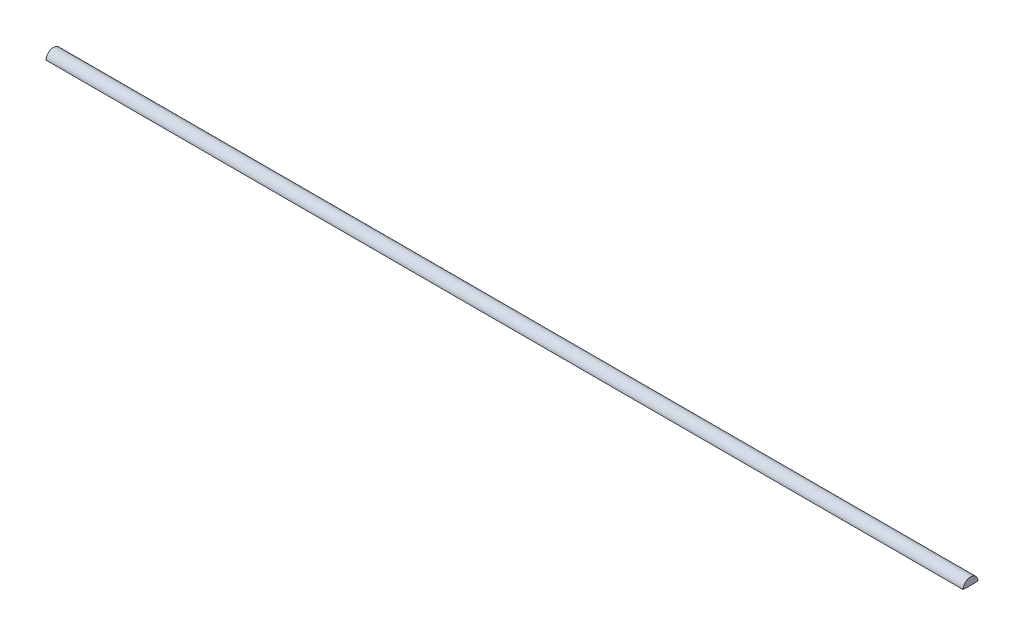
ISO-10303-21;
HEADER;
FILE_DESCRIPTION(('STEP AP214'),'2;1');
FILE_NAME('part.step','',(''),(''),'','','');
FILE_SCHEMA(('AUTOMOTIVE_DESIGN { 1 0 10303 214 1 1 1 1 }'));
ENDSEC;
DATA;
#1=APPLICATION_CONTEXT('core data for automotive mechanical design processes');
#2=APPLICATION_PROTOCOL_DEFINITION('international standard','automotive_design',2000,#1);
#3=PRODUCT_CONTEXT('',#1,'mechanical');
#4=PRODUCT('Part','Part','',(#3));
#5=PRODUCT_RELATED_PRODUCT_CATEGORY('part','',(#4));
#6=PRODUCT_DEFINITION_FORMATION('','',#4);
#7=PRODUCT_DEFINITION_CONTEXT('part definition',#1,'design');
#8=PRODUCT_DEFINITION('design','',#6,#7);
#9=PRODUCT_DEFINITION_SHAPE('','',#8);
#10=(LENGTH_UNIT() NAMED_UNIT(*) SI_UNIT(.MILLI.,.METRE.));
#11=(NAMED_UNIT(*) PLANE_ANGLE_UNIT() SI_UNIT($,.RADIAN.));
#12=(NAMED_UNIT(*) SI_UNIT($,.STERADIAN.) SOLID_ANGLE_UNIT());
#13=UNCERTAINTY_MEASURE_WITH_UNIT(LENGTH_MEASURE(1.E-05),#10,'distance_accuracy_value','');
#14=(GEOMETRIC_REPRESENTATION_CONTEXT(3) GLOBAL_UNCERTAINTY_ASSIGNED_CONTEXT((#13)) GLOBAL_UNIT_ASSIGNED_CONTEXT((#10,
#11,#12)) REPRESENTATION_CONTEXT('',''));
#15=CARTESIAN_POINT('',(0.,0.,0.));
#16=DIRECTION('',(0.,0.,1.));
#17=DIRECTION('',(1.,0.,0.));
#18=AXIS2_PLACEMENT_3D('',#15,#16,#17);
#19=CARTESIAN_POINT('',(389.89,-63.5,0.));
#20=DIRECTION('',(-1.,0.,0.));
#21=DIRECTION('',(0.,0.,1.));
#22=AXIS2_PLACEMENT_3D('',#19,#20,#21);
#23=CYLINDRICAL_SURFACE('',#22,3.17500000000022);
#24=CARTESIAN_POINT('',(0.,-63.5,0.));
#25=DIRECTION('',(1.,0.,0.));
#26=DIRECTION('',(0.,0.,-1.));
#27=AXIS2_PLACEMENT_3D('',#24,#25,#26);
#28=CIRCLE('',#27,3.17500000000022);
#29=CARTESIAN_POINT('',(0.,-63.420625,-3.17400765742244));
#30=VERTEX_POINT('',#29);
#31=CARTESIAN_POINT('',(0.,-63.420625,3.17400765742246));
#32=VERTEX_POINT('',#31);
#33=EDGE_CURVE('E70',#30,#32,#28,.T.);
#34=ORIENTED_EDGE('',*,*,#33,.T.);
#35=DIRECTION('',(-1.,0.,0.));
#36=VECTOR('',#35,1.);
#37=CARTESIAN_POINT('',(389.89,-63.420625,3.17400765742246));
#38=LINE('',#37,#36);
#39=CARTESIAN_POINT('',(389.89,-63.420625,3.17400765742246));
#40=VERTEX_POINT('',#39);
#41=EDGE_CURVE('E11',#40,#32,#38,.T.);
#42=ORIENTED_EDGE('',*,*,#41,.F.);
#43=CARTESIAN_POINT('',(389.89,-63.5,0.));
#44=DIRECTION('',(1.,0.,0.));
#45=DIRECTION('',(0.,0.,-1.));
#46=AXIS2_PLACEMENT_3D('',#43,#44,#45);
#47=CIRCLE('',#46,3.17500000000022);
#48=CARTESIAN_POINT('',(389.89,-63.420625,-3.17400765742244));
#49=VERTEX_POINT('',#48);
#50=EDGE_CURVE('E68',#49,#40,#47,.T.);
#51=ORIENTED_EDGE('',*,*,#50,.F.);
#52=DIRECTION('',(-1.,0.,0.));
#53=VECTOR('',#52,1.);
#54=CARTESIAN_POINT('',(389.89,-63.420625,-3.17400765742244));
#55=LINE('',#54,#53);
#56=EDGE_CURVE('E50',#49,#30,#55,.T.);
#57=ORIENTED_EDGE('',*,*,#56,.T.);
#58=EDGE_LOOP('',(#34,#42,#51,#57));
#59=FACE_BOUND('',#58,.T.);
#60=ADVANCED_FACE('F39',(#59),#23,.T.);
#61=CARTESIAN_POINT('',(389.89,0.,0.));
#62=DIRECTION('',(-1.,0.,0.));
#63=DIRECTION('',(0.,0.,1.));
#64=AXIS2_PLACEMENT_3D('',#61,#62,#63);
#65=CYLINDRICAL_SURFACE('',#64,63.5);
#66=CARTESIAN_POINT('',(0.,0.,0.));
#67=DIRECTION('',(1.,0.,0.));
#68=DIRECTION('',(0.,0.,-1.));
#69=AXIS2_PLACEMENT_3D('',#66,#67,#68);
#70=CIRCLE('',#69,63.5);
#71=EDGE_CURVE('E64',#32,#30,#70,.T.);
#72=ORIENTED_EDGE('',*,*,#71,.T.);
#73=ORIENTED_EDGE('',*,*,#56,.F.);
#74=CARTESIAN_POINT('',(389.89,0.,0.));
#75=DIRECTION('',(1.,0.,0.));
#76=DIRECTION('',(0.,0.,-1.));
#77=AXIS2_PLACEMENT_3D('',#74,#75,#76);
#78=CIRCLE('',#77,63.5);
#79=EDGE_CURVE('E53',#40,#49,#78,.T.);
#80=ORIENTED_EDGE('',*,*,#79,.F.);
#81=ORIENTED_EDGE('',*,*,#41,.T.);
#82=EDGE_LOOP('',(#72,#73,#80,#81));
#83=FACE_BOUND('',#82,.T.);
#84=ADVANCED_FACE('F63',(#83),#65,.T.);
#85=CARTESIAN_POINT('',(389.89,-31.75,0.));
#86=DIRECTION('',(1.,0.,0.));
#87=DIRECTION('',(0.,0.,-1.));
#88=AXIS2_PLACEMENT_3D('',#85,#86,#87);
#89=PLANE('',#88);
#90=ORIENTED_EDGE('',*,*,#50,.T.);
#91=ORIENTED_EDGE('',*,*,#79,.T.);
#92=EDGE_LOOP('',(#90,#91));
#93=FACE_BOUND('',#92,.T.);
#94=ADVANCED_FACE('F79',(#93),#89,.T.);
#95=CARTESIAN_POINT('',(0.,-31.75,0.));
#96=DIRECTION('',(1.,0.,0.));
#97=DIRECTION('',(0.,0.,-1.));
#98=AXIS2_PLACEMENT_3D('',#95,#96,#97);
#99=PLANE('',#98);
#100=ORIENTED_EDGE('',*,*,#33,.F.);
#101=ORIENTED_EDGE('',*,*,#71,.F.);
#102=EDGE_LOOP('',(#100,#101));
#103=FACE_BOUND('',#102,.T.);
#104=ADVANCED_FACE('F71',(#103),#99,.F.);
#105=CLOSED_SHELL('',(#60,#84,#94,#104));
#106=MANIFOLD_SOLID_BREP('B2',#105);
#107=ADVANCED_BREP_SHAPE_REPRESENTATION('',(#18,#106),#14);
#108=SHAPE_DEFINITION_REPRESENTATION(#9,#107);
ENDSEC;
END-ISO-10303-21;
